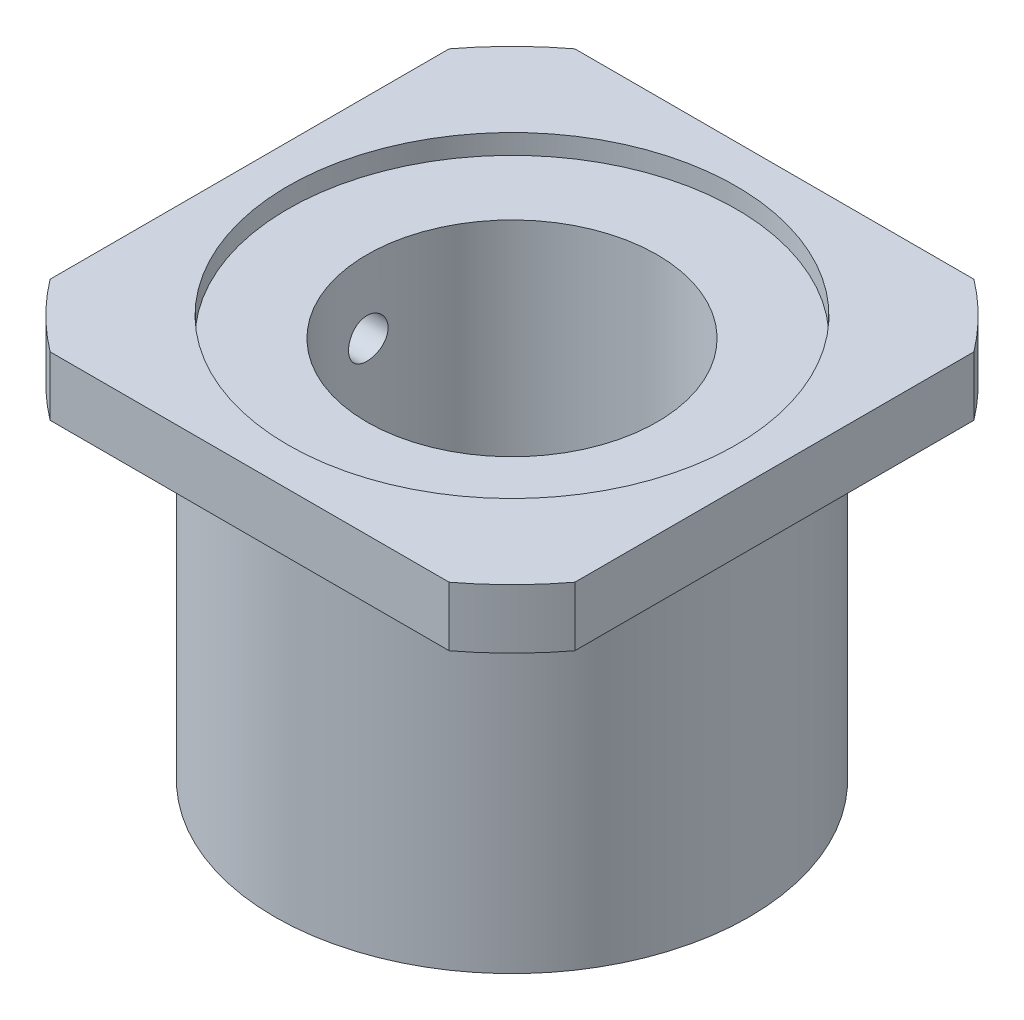
ISO-10303-21;
HEADER;
FILE_DESCRIPTION(('STEP AP214'),'2;1');
FILE_NAME('part.step','',(''),(''),'','','');
FILE_SCHEMA(('AUTOMOTIVE_DESIGN { 1 0 10303 214 1 1 1 1 }'));
ENDSEC;
DATA;
#1=APPLICATION_CONTEXT('core data for automotive mechanical design processes');
#2=APPLICATION_PROTOCOL_DEFINITION('international standard','automotive_design',2000,#1);
#3=PRODUCT_CONTEXT('',#1,'mechanical');
#4=PRODUCT('Part','Part','',(#3));
#5=PRODUCT_RELATED_PRODUCT_CATEGORY('part','',(#4));
#6=PRODUCT_DEFINITION_FORMATION('','',#4);
#7=PRODUCT_DEFINITION_CONTEXT('part definition',#1,'design');
#8=PRODUCT_DEFINITION('design','',#6,#7);
#9=PRODUCT_DEFINITION_SHAPE('','',#8);
#10=(LENGTH_UNIT() NAMED_UNIT(*) SI_UNIT(.MILLI.,.METRE.));
#11=(NAMED_UNIT(*) PLANE_ANGLE_UNIT() SI_UNIT($,.RADIAN.));
#12=(NAMED_UNIT(*) SI_UNIT($,.STERADIAN.) SOLID_ANGLE_UNIT());
#13=UNCERTAINTY_MEASURE_WITH_UNIT(LENGTH_MEASURE(1.E-05),#10,'distance_accuracy_value','');
#14=(GEOMETRIC_REPRESENTATION_CONTEXT(3) GLOBAL_UNCERTAINTY_ASSIGNED_CONTEXT((#13)) GLOBAL_UNIT_ASSIGNED_CONTEXT((#10,
#11,#12)) REPRESENTATION_CONTEXT('',''));
#15=CARTESIAN_POINT('',(0.,0.,0.));
#16=DIRECTION('',(0.,0.,1.));
#17=DIRECTION('',(1.,0.,0.));
#18=AXIS2_PLACEMENT_3D('',#15,#16,#17);
#19=CARTESIAN_POINT('',(0.,47.,0.));
#20=DIRECTION('',(0.,1.,0.));
#21=DIRECTION('',(0.,0.,1.));
#22=AXIS2_PLACEMENT_3D('',#19,#20,#21);
#23=PLANE('',#22);
#24=CARTESIAN_POINT('',(0.,47.,0.));
#25=DIRECTION('',(0.,1.,0.));
#26=DIRECTION('',(0.,0.,1.));
#27=AXIS2_PLACEMENT_3D('',#24,#25,#26);
#28=CIRCLE('',#27,11.);
#29=CARTESIAN_POINT('',(0.,47.,11.));
#30=VERTEX_POINT('',#29);
#31=EDGE_CURVE('E240',#30,#30,#28,.F.);
#32=ORIENTED_EDGE('',*,*,#31,.T.);
#33=EDGE_LOOP('',(#32));
#34=FACE_BOUND('',#33,.T.);
#35=CARTESIAN_POINT('',(0.,47.,0.));
#36=DIRECTION('',(0.,1.,0.));
#37=DIRECTION('',(0.,0.,1.));
#38=AXIS2_PLACEMENT_3D('',#35,#36,#37);
#39=CIRCLE('',#38,17.);
#40=CARTESIAN_POINT('',(0.,47.,17.));
#41=VERTEX_POINT('',#40);
#42=EDGE_CURVE('E13',#41,#41,#39,.F.);
#43=ORIENTED_EDGE('',*,*,#42,.F.);
#44=EDGE_LOOP('',(#43));
#45=FACE_BOUND('',#44,.T.);
#46=ADVANCED_FACE('F41',(#34,#45),#23,.T.);
#47=CARTESIAN_POINT('',(0.,120.710678118655,0.));
#48=DIRECTION('',(0.,-1.,0.));
#49=DIRECTION('',(0.,0.,-1.));
#50=AXIS2_PLACEMENT_3D('',#47,#48,#49);
#51=CYLINDRICAL_SURFACE('',#50,18.);
#52=CARTESIAN_POINT('',(0.,18.,0.));
#53=DIRECTION('',(0.,-1.,0.));
#54=DIRECTION('',(0.,0.,-1.));
#55=AXIS2_PLACEMENT_3D('',#52,#53,#54);
#56=CIRCLE('',#55,18.);
#57=CARTESIAN_POINT('',(0.,18.,-18.));
#58=VERTEX_POINT('',#57);
#59=EDGE_CURVE('E118',#58,#58,#56,.T.);
#60=ORIENTED_EDGE('',*,*,#59,.F.);
#61=EDGE_LOOP('',(#60));
#62=FACE_BOUND('',#61,.T.);
#63=CARTESIAN_POINT('',(0.,44.,0.));
#64=DIRECTION('',(0.,-1.,0.));
#65=DIRECTION('',(0.,0.,-1.));
#66=AXIS2_PLACEMENT_3D('',#63,#64,#65);
#67=CIRCLE('',#66,18.);
#68=CARTESIAN_POINT('',(0.,44.,-18.));
#69=VERTEX_POINT('',#68);
#70=EDGE_CURVE('E49',#69,#69,#67,.F.);
#71=ORIENTED_EDGE('',*,*,#70,.F.);
#72=EDGE_LOOP('',(#71));
#73=FACE_BOUND('',#72,.T.);
#74=CARTESIAN_POINT('',(-17.9373911146521,41.5,1.49999999999992));
#75=CARTESIAN_POINT('',(-17.9373919441254,41.4159014368144,1.49999632624549));
#76=CARTESIAN_POINT('',(-17.9379889197393,41.3317456207635,1.49290363793965));
#77=CARTESIAN_POINT('',(-17.940312296239,41.1657624694848,1.46471396861135));
#78=CARTESIAN_POINT('',(-17.942039976827,41.0839378823086,1.4436011195424));
#79=CARTESIAN_POINT('',(-17.9464277324401,40.925045205812,1.38798597710621));
#80=CARTESIAN_POINT('',(-17.949087278784,40.8479744485676,1.35349127456321));
#81=CARTESIAN_POINT('',(-17.9550384405243,40.7007352071851,1.27210510272811));
#82=CARTESIAN_POINT('',(-17.9583299207505,40.6305652518174,1.22521628371896));
#83=CARTESIAN_POINT('',(-17.9651835716923,40.4989209954,1.12024280468697));
#84=CARTESIAN_POINT('',(-17.9687463415354,40.4374668522055,1.06213290210273));
#85=CARTESIAN_POINT('',(-17.9757356491616,40.325171850643,0.936420181014058));
#86=CARTESIAN_POINT('',(-17.9791621809873,40.2743314559686,0.868816947980433));
#87=CARTESIAN_POINT('',(-17.9854986076128,40.1846400780157,0.725916367963101));
#88=CARTESIAN_POINT('',(-17.9884077482992,40.1458065352278,0.650608038188705));
#89=CARTESIAN_POINT('',(-17.9933751565843,40.0813427633222,0.494511600748062));
#90=CARTESIAN_POINT('',(-17.995433439076,40.0557123031027,0.41372358902416));
#91=CARTESIAN_POINT('',(-17.99846303179,40.0184402742159,0.249161693921634));
#92=CARTESIAN_POINT('',(-17.9994368756993,40.0067660933208,0.165395244348399));
#93=CARTESIAN_POINT('',(-18.0001964510134,39.9976371952231,-0.00291342283481244));
#94=CARTESIAN_POINT('',(-17.9999822045124,40.0001822135951,-0.0874556259894064));
#95=CARTESIAN_POINT('',(-17.9983918295819,40.0193927982691,-0.254694827278307));
#96=CARTESIAN_POINT('',(-17.9970185868379,40.0360232947063,-0.337395885108784));
#97=CARTESIAN_POINT('',(-17.9932679978193,40.0828782264431,-0.498828699060453));
#98=CARTESIAN_POINT('',(-17.9908906419909,40.1131027910838,-0.577560417407338));
#99=CARTESIAN_POINT('',(-17.9853943186844,40.1863269806778,-0.728931240955368));
#100=CARTESIAN_POINT('',(-17.9822744403804,40.2293423118981,-0.801562713988543));
#101=CARTESIAN_POINT('',(-17.9756436790388,40.3269155823679,-0.938588003816135));
#102=CARTESIAN_POINT('',(-17.9721327880706,40.3814737557484,-1.00298165347489));
#103=CARTESIAN_POINT('',(-17.965101971209,40.5007816599329,-1.12190844717293));
#104=CARTESIAN_POINT('',(-17.96158205029,40.5655618642282,-1.17641102499762));
#105=CARTESIAN_POINT('',(-17.9549406265857,40.7033687576745,-1.27377239838414));
#106=CARTESIAN_POINT('',(-17.9518191241289,40.7763954536233,-1.31663118434756));
#107=CARTESIAN_POINT('',(-17.9463273914548,40.9286438316577,-1.38948720688996));
#108=CARTESIAN_POINT('',(-17.9439572539101,41.0078662764203,-1.41948285710213));
#109=CARTESIAN_POINT('',(-17.9402383991997,41.1702470770765,-1.46573851054285));
#110=CARTESIAN_POINT('',(-17.9388896605602,41.2534053501847,-1.48199880254229));
#111=CARTESIAN_POINT('',(-17.937369793448,41.4210297798329,-1.50028347436901));
#112=CARTESIAN_POINT('',(-17.9371951390236,41.5054912561703,-1.50235047917691));
#113=CARTESIAN_POINT('',(-17.9380339082073,41.6735595154744,-1.49230155756731));
#114=CARTESIAN_POINT('',(-17.9390473207338,41.7571663064058,-1.48018576343831));
#115=CARTESIAN_POINT('',(-17.9421448221712,41.9210295336993,-1.4421507018638));
#116=CARTESIAN_POINT('',(-17.9442273679871,42.0012906189446,-1.41625132648426));
#117=CARTESIAN_POINT('',(-17.9492272046942,42.1563281232456,-1.35140451334484));
#118=CARTESIAN_POINT('',(-17.9521445089793,42.2311044542729,-1.31245686622068));
#119=CARTESIAN_POINT('',(-17.9584937019478,42.3732448783289,-1.2225112319685));
#120=CARTESIAN_POINT('',(-17.9619267965011,42.4405909425976,-1.17148484052764));
#121=CARTESIAN_POINT('',(-17.9689166666067,42.5657769113602,-1.05887119262334));
#122=CARTESIAN_POINT('',(-17.9724734442863,42.6236166522435,-0.997283754433981));
#123=CARTESIAN_POINT('',(-17.9793204166324,42.7282936086551,-0.865112059367695));
#124=CARTESIAN_POINT('',(-17.9826099269711,42.7751031295047,-0.794505828614824));
#125=CARTESIAN_POINT('',(-17.9885418580659,42.8562008703468,-0.646410289821683));
#126=CARTESIAN_POINT('',(-17.9911842852881,42.8904892154631,-0.56892105057274));
#127=CARTESIAN_POINT('',(-17.9955211682902,42.9455237236241,-0.409358368150632));
#128=CARTESIAN_POINT('',(-17.9972168225275,42.9662870127188,-0.327290865780985));
#129=CARTESIAN_POINT('',(-17.9994739699475,42.9937379886311,-0.160819768599526));
#130=CARTESIAN_POINT('',(-18.0000354845981,43.0004259418774,-0.0764162180368215));
#131=CARTESIAN_POINT('',(-17.9999611181007,42.9995332905985,0.0920580725937739));
#132=CARTESIAN_POINT('',(-17.9993288589703,42.9919958472422,0.176129046317001));
#133=CARTESIAN_POINT('',(-17.9969451509331,42.9629563682327,0.341806668091923));
#134=CARTESIAN_POINT('',(-17.9951937005063,42.9414543136124,0.423413312796343));
#135=CARTESIAN_POINT('',(-17.990768125559,42.8851069448164,0.58184856967305));
#136=CARTESIAN_POINT('',(-17.9880940546532,42.8502624059756,0.658677459180312));
#137=CARTESIAN_POINT('',(-17.9821223994119,42.7682241319035,0.805401859348455));
#138=CARTESIAN_POINT('',(-17.9788248249368,42.7210305919612,0.875297479629008));
#139=CARTESIAN_POINT('',(-17.9719643775245,42.6154719777264,1.00639213413811));
#140=CARTESIAN_POINT('',(-17.9684007644022,42.5570749669802,1.06756541397684));
#141=CARTESIAN_POINT('',(-17.9614161747032,42.430824746911,1.17926673983924));
#142=CARTESIAN_POINT('',(-17.9579952328797,42.3629692508757,1.22979220417227));
#143=CARTESIAN_POINT('',(-17.9516763661302,42.2195964989486,1.3188320684682));
#144=CARTESIAN_POINT('',(-17.9487794332231,42.1440651249981,1.35732378518762));
#145=CARTESIAN_POINT('',(-17.9438486940789,41.9876388448981,1.42102935140061));
#146=CARTESIAN_POINT('',(-17.9418138960345,41.9067502263742,1.44625846639412));
#147=CARTESIAN_POINT('',(-17.939361122821,41.7711536736592,1.47629714700905));
#148=CARTESIAN_POINT('',(-17.9386257658358,41.7173178208321,1.48517390108758));
#149=CARTESIAN_POINT('',(-17.9376404935845,41.6089959952377,1.49702651025991));
#150=CARTESIAN_POINT('',(-17.9373905770138,41.5545100242178,1.50000238121115));
#151=CARTESIAN_POINT('',(-17.9373911146521,41.5,1.49999999999992));
#152=B_SPLINE_CURVE_WITH_KNOTS('',3,(#74,#75,#76,#77,#78,#79,#80,#81,#82,#83,#84,#85,#86,#87,
#88,#89,#90,#91,#92,#93,#94,#95,#96,#97,#98,#99,#100,#101,#102,#103,#104,#105,#106,#107,#108,
#109,#110,#111,#112,#113,#114,#115,#116,#117,#118,#119,#120,#121,#122,#123,#124,#125,#126,#127,
#128,#129,#130,#131,#132,#133,#134,#135,#136,#137,#138,#139,#140,#141,#142,#143,#144,#145,#146,
#147,#148,#149,#150,#151),.UNSPECIFIED.,.T.,.F.,(4,2,2,2,2,2,2,2,2,2,2,2,2,2,2,2,2,2,2,2,2,2,2,
2,2,2,2,2,2,2,2,2,2,2,2,2,2,2,4),(0.,0.25209666307589,0.504479137075762,0.756718656565784,
1.00890428225374,1.26166396783763,1.51443469368452,1.76757087390709,2.02070262317667,
2.27324170533034,2.52577609119157,2.77768356187026,3.02959342937964,3.28181391301508,
3.53403951309371,3.78703176034209,4.0400242161406,4.29304786367221,4.54606619152565,
4.79832432644862,5.05058010848024,5.3024728255471,5.55436958451819,5.80686469264508,
6.05936414593926,6.31249097605478,6.56561527661195,6.81841843321506,7.07121680452792,
7.32324939506093,7.575282327912,7.82730061729244,8.07931492145808,8.33205858485542,
8.58486345866072,8.83814202808076,9.09112842731077,9.25452993641401,9.41793100640812),.UNSPECIFIED.);
#153=CARTESIAN_POINT('',(-17.9373911146521,41.5,1.49999999999992));
#154=VERTEX_POINT('',#153);
#155=EDGE_CURVE('E152',#154,#154,#152,.T.);
#156=ORIENTED_EDGE('',*,*,#155,.T.);
#157=EDGE_LOOP('',(#156));
#158=FACE_BOUND('',#157,.T.);
#159=ADVANCED_FACE('F182',(#62,#73,#158),#51,.T.);
#160=CARTESIAN_POINT('',(0.,50.,0.));
#161=DIRECTION('',(0.,-1.,0.));
#162=DIRECTION('',(0.,0.,-1.));
#163=AXIS2_PLACEMENT_3D('',#160,#161,#162);
#164=CYLINDRICAL_SURFACE('',#163,25.);
#165=DIRECTION('',(0.,1.,0.));
#166=VECTOR('',#165,1.);
#167=CARTESIAN_POINT('',(-19.8999999999999,15.3084702238548,-15.1324155375142));
#168=LINE('',#167,#166);
#169=CARTESIAN_POINT('',(-19.8999999999999,44.,-15.1324155375142));
#170=VERTEX_POINT('',#169);
#171=CARTESIAN_POINT('',(-19.8999999999999,48.5,-15.1324155375142));
#172=VERTEX_POINT('',#171);
#173=EDGE_CURVE('E108',#170,#172,#168,.T.);
#174=ORIENTED_EDGE('',*,*,#173,.T.);
#175=CARTESIAN_POINT('',(0.,48.5,0.));
#176=DIRECTION('',(0.,1.,0.));
#177=DIRECTION('',(0.,0.,1.));
#178=AXIS2_PLACEMENT_3D('',#175,#176,#177);
#179=CIRCLE('',#178,25.);
#180=CARTESIAN_POINT('',(-15.1324155375141,48.5,-19.9000000000001));
#181=VERTEX_POINT('',#180);
#182=EDGE_CURVE('E111',#181,#172,#179,.T.);
#183=ORIENTED_EDGE('',*,*,#182,.F.);
#184=DIRECTION('',(0.,1.,0.));
#185=VECTOR('',#184,1.);
#186=CARTESIAN_POINT('',(-15.1324155375141,15.3084702238548,-19.9000000000001));
#187=LINE('',#186,#185);
#188=CARTESIAN_POINT('',(-15.1324155375141,44.,-19.9000000000001));
#189=VERTEX_POINT('',#188);
#190=EDGE_CURVE('E256',#189,#181,#187,.T.);
#191=ORIENTED_EDGE('',*,*,#190,.F.);
#192=CARTESIAN_POINT('',(0.,44.,0.));
#193=DIRECTION('',(0.,-1.,0.));
#194=DIRECTION('',(0.,0.,-1.));
#195=AXIS2_PLACEMENT_3D('',#192,#193,#194);
#196=CIRCLE('',#195,25.);
#197=EDGE_CURVE('E113',#170,#189,#196,.T.);
#198=ORIENTED_EDGE('',*,*,#197,.F.);
#199=EDGE_LOOP('',(#174,#183,#191,#198));
#200=FACE_BOUND('',#199,.T.);
#201=ADVANCED_FACE('F43',(#200),#164,.T.);
#202=DIRECTION('',(0.,1.,0.));
#203=VECTOR('',#202,1.);
#204=CARTESIAN_POINT('',(-15.1324155375143,15.3084702238548,19.8999999999999));
#205=LINE('',#204,#203);
#206=CARTESIAN_POINT('',(-15.1324155375143,44.,19.8999999999999));
#207=VERTEX_POINT('',#206);
#208=CARTESIAN_POINT('',(-15.1324155375143,48.5,19.8999999999999));
#209=VERTEX_POINT('',#208);
#210=EDGE_CURVE('E56',#207,#209,#205,.T.);
#211=ORIENTED_EDGE('',*,*,#210,.T.);
#212=CARTESIAN_POINT('',(0.,48.5,0.));
#213=DIRECTION('',(0.,1.,0.));
#214=DIRECTION('',(0.,0.,1.));
#215=AXIS2_PLACEMENT_3D('',#212,#213,#214);
#216=CIRCLE('',#215,25.);
#217=CARTESIAN_POINT('',(-19.9000000000002,48.5,15.132415537514));
#218=VERTEX_POINT('',#217);
#219=EDGE_CURVE('E126',#218,#209,#216,.T.);
#220=ORIENTED_EDGE('',*,*,#219,.F.);
#221=DIRECTION('',(0.,1.,0.));
#222=VECTOR('',#221,1.);
#223=CARTESIAN_POINT('',(-19.9000000000001,15.3084702238548,15.132415537514));
#224=LINE('',#223,#222);
#225=CARTESIAN_POINT('',(-19.9000000000001,44.,15.132415537514));
#226=VERTEX_POINT('',#225);
#227=EDGE_CURVE('E117',#226,#218,#224,.T.);
#228=ORIENTED_EDGE('',*,*,#227,.F.);
#229=CARTESIAN_POINT('',(0.,44.,0.));
#230=DIRECTION('',(0.,-1.,0.));
#231=DIRECTION('',(0.,0.,-1.));
#232=AXIS2_PLACEMENT_3D('',#229,#230,#231);
#233=CIRCLE('',#232,25.);
#234=EDGE_CURVE('E292',#207,#226,#233,.T.);
#235=ORIENTED_EDGE('',*,*,#234,.F.);
#236=EDGE_LOOP('',(#211,#220,#228,#235));
#237=FACE_BOUND('',#236,.T.);
#238=ADVANCED_FACE('F318',(#237),#164,.T.);
#239=DIRECTION('',(0.,1.,0.));
#240=VECTOR('',#239,1.);
#241=CARTESIAN_POINT('',(15.1324155375142,15.3084702238548,-19.8999999999999));
#242=LINE('',#241,#240);
#243=CARTESIAN_POINT('',(15.1324155375142,44.,-19.8999999999999));
#244=VERTEX_POINT('',#243);
#245=CARTESIAN_POINT('',(15.1324155375142,48.5,-19.8999999999999));
#246=VERTEX_POINT('',#245);
#247=EDGE_CURVE('E258',#244,#246,#242,.T.);
#248=ORIENTED_EDGE('',*,*,#247,.T.);
#249=CARTESIAN_POINT('',(0.,48.5,0.));
#250=DIRECTION('',(0.,1.,0.));
#251=DIRECTION('',(0.,0.,1.));
#252=AXIS2_PLACEMENT_3D('',#249,#250,#251);
#253=CIRCLE('',#252,25.);
#254=CARTESIAN_POINT('',(19.9,48.5,-15.1324155375141));
#255=VERTEX_POINT('',#254);
#256=EDGE_CURVE('E149',#255,#246,#253,.T.);
#257=ORIENTED_EDGE('',*,*,#256,.F.);
#258=DIRECTION('',(0.,1.,0.));
#259=VECTOR('',#258,1.);
#260=CARTESIAN_POINT('',(19.9,15.3084702238548,-15.1324155375141));
#261=LINE('',#260,#259);
#262=CARTESIAN_POINT('',(19.9,44.,-15.1324155375141));
#263=VERTEX_POINT('',#262);
#264=EDGE_CURVE('E260',#263,#255,#261,.T.);
#265=ORIENTED_EDGE('',*,*,#264,.F.);
#266=CARTESIAN_POINT('',(0.,44.,0.));
#267=DIRECTION('',(0.,-1.,0.));
#268=DIRECTION('',(0.,0.,-1.));
#269=AXIS2_PLACEMENT_3D('',#266,#267,#268);
#270=CIRCLE('',#269,25.);
#271=EDGE_CURVE('E283',#244,#263,#270,.T.);
#272=ORIENTED_EDGE('',*,*,#271,.F.);
#273=EDGE_LOOP('',(#248,#257,#265,#272));
#274=FACE_BOUND('',#273,.T.);
#275=ADVANCED_FACE('F324',(#274),#164,.T.);
#276=DIRECTION('',(0.,1.,0.));
#277=VECTOR('',#276,1.);
#278=CARTESIAN_POINT('',(19.8999999999999,15.3084702238548,15.1324155375143));
#279=LINE('',#278,#277);
#280=CARTESIAN_POINT('',(19.8999999999999,44.,15.1324155375143));
#281=VERTEX_POINT('',#280);
#282=CARTESIAN_POINT('',(19.8999999999999,48.5,15.1324155375143));
#283=VERTEX_POINT('',#282);
#284=EDGE_CURVE('E253',#281,#283,#279,.T.);
#285=ORIENTED_EDGE('',*,*,#284,.T.);
#286=CARTESIAN_POINT('',(0.,48.5,0.));
#287=DIRECTION('',(0.,1.,0.));
#288=DIRECTION('',(0.,0.,1.));
#289=AXIS2_PLACEMENT_3D('',#286,#287,#288);
#290=CIRCLE('',#289,25.);
#291=CARTESIAN_POINT('',(15.1324155375141,48.5,19.9000000000001));
#292=VERTEX_POINT('',#291);
#293=EDGE_CURVE('E143',#292,#283,#290,.T.);
#294=ORIENTED_EDGE('',*,*,#293,.F.);
#295=DIRECTION('',(0.,1.,0.));
#296=VECTOR('',#295,1.);
#297=CARTESIAN_POINT('',(15.1324155375141,15.3084702238548,19.9000000000001));
#298=LINE('',#297,#296);
#299=CARTESIAN_POINT('',(15.1324155375141,44.,19.9000000000001));
#300=VERTEX_POINT('',#299);
#301=EDGE_CURVE('E64',#300,#292,#298,.T.);
#302=ORIENTED_EDGE('',*,*,#301,.F.);
#303=CARTESIAN_POINT('',(0.,44.,0.));
#304=DIRECTION('',(0.,-1.,0.));
#305=DIRECTION('',(0.,0.,-1.));
#306=AXIS2_PLACEMENT_3D('',#303,#304,#305);
#307=CIRCLE('',#306,25.);
#308=EDGE_CURVE('E278',#281,#300,#307,.T.);
#309=ORIENTED_EDGE('',*,*,#308,.F.);
#310=EDGE_LOOP('',(#285,#294,#302,#309));
#311=FACE_BOUND('',#310,.T.);
#312=ADVANCED_FACE('F191',(#311),#164,.T.);
#313=CARTESIAN_POINT('',(0.,15.3084702238548,19.9));
#314=DIRECTION('',(0.,0.,-1.));
#315=DIRECTION('',(-1.,0.,0.));
#316=AXIS2_PLACEMENT_3D('',#313,#314,#315);
#317=PLANE('',#316);
#318=ORIENTED_EDGE('',*,*,#301,.T.);
#319=DIRECTION('',(1.,0.,0.));
#320=VECTOR('',#319,1.);
#321=CARTESIAN_POINT('',(-15.1324155375143,48.5,19.8999999999999));
#322=LINE('',#321,#320);
#323=EDGE_CURVE('E140',#209,#292,#322,.T.);
#324=ORIENTED_EDGE('',*,*,#323,.F.);
#325=ORIENTED_EDGE('',*,*,#210,.F.);
#326=DIRECTION('',(-1.,0.,0.));
#327=VECTOR('',#326,1.);
#328=CARTESIAN_POINT('',(0.,44.,19.9));
#329=LINE('',#328,#327);
#330=EDGE_CURVE('E276',#300,#207,#329,.T.);
#331=ORIENTED_EDGE('',*,*,#330,.F.);
#332=EDGE_LOOP('',(#318,#324,#325,#331));
#333=FACE_BOUND('',#332,.T.);
#334=ADVANCED_FACE('F187',(#333),#317,.F.);
#335=CARTESIAN_POINT('',(19.9,15.3084702238548,0.));
#336=DIRECTION('',(-1.,0.,0.));
#337=DIRECTION('',(0.,0.,1.));
#338=AXIS2_PLACEMENT_3D('',#335,#336,#337);
#339=PLANE('',#338);
#340=ORIENTED_EDGE('',*,*,#264,.T.);
#341=DIRECTION('',(0.,0.,-1.));
#342=VECTOR('',#341,1.);
#343=CARTESIAN_POINT('',(19.8999999999999,48.5,15.1324155375143));
#344=LINE('',#343,#342);
#345=EDGE_CURVE('E146',#283,#255,#344,.T.);
#346=ORIENTED_EDGE('',*,*,#345,.F.);
#347=ORIENTED_EDGE('',*,*,#284,.F.);
#348=DIRECTION('',(0.,0.,1.));
#349=VECTOR('',#348,1.);
#350=CARTESIAN_POINT('',(19.9,44.,0.));
#351=LINE('',#350,#349);
#352=EDGE_CURVE('E280',#263,#281,#351,.T.);
#353=ORIENTED_EDGE('',*,*,#352,.F.);
#354=EDGE_LOOP('',(#340,#346,#347,#353));
#355=FACE_BOUND('',#354,.T.);
#356=ADVANCED_FACE('F190',(#355),#339,.F.);
#357=CARTESIAN_POINT('',(0.,15.3084702238548,-19.9));
#358=DIRECTION('',(0.,0.,1.));
#359=DIRECTION('',(1.,0.,0.));
#360=AXIS2_PLACEMENT_3D('',#357,#358,#359);
#361=PLANE('',#360);
#362=ORIENTED_EDGE('',*,*,#190,.T.);
#363=DIRECTION('',(-1.,0.,0.));
#364=VECTOR('',#363,1.);
#365=CARTESIAN_POINT('',(15.1324155375142,48.5,-19.8999999999999));
#366=LINE('',#365,#364);
#367=EDGE_CURVE('E133',#246,#181,#366,.T.);
#368=ORIENTED_EDGE('',*,*,#367,.F.);
#369=ORIENTED_EDGE('',*,*,#247,.F.);
#370=DIRECTION('',(1.,0.,0.));
#371=VECTOR('',#370,1.);
#372=CARTESIAN_POINT('',(0.,44.,-19.9));
#373=LINE('',#372,#371);
#374=EDGE_CURVE('E286',#189,#244,#373,.T.);
#375=ORIENTED_EDGE('',*,*,#374,.F.);
#376=EDGE_LOOP('',(#362,#368,#369,#375));
#377=FACE_BOUND('',#376,.T.);
#378=ADVANCED_FACE('F195',(#377),#361,.F.);
#379=CARTESIAN_POINT('',(-19.9,15.3084702238548,-1.27836430677052E-13));
#380=DIRECTION('',(-1.,0.,0.));
#381=DIRECTION('',(0.,0.,1.));
#382=AXIS2_PLACEMENT_3D('',#379,#380,#381);
#383=PLANE('',#382);
#384=ORIENTED_EDGE('',*,*,#227,.T.);
#385=DIRECTION('',(0.,0.,1.));
#386=VECTOR('',#385,1.);
#387=CARTESIAN_POINT('',(-19.8999999999999,48.5,-15.1324155375142));
#388=LINE('',#387,#386);
#389=EDGE_CURVE('E121',#172,#218,#388,.T.);
#390=ORIENTED_EDGE('',*,*,#389,.F.);
#391=ORIENTED_EDGE('',*,*,#173,.F.);
#392=DIRECTION('',(0.,0.,-1.));
#393=VECTOR('',#392,1.);
#394=CARTESIAN_POINT('',(-19.9,44.,-1.27836430677052E-13));
#395=LINE('',#394,#393);
#396=EDGE_CURVE('E290',#226,#170,#395,.T.);
#397=ORIENTED_EDGE('',*,*,#396,.F.);
#398=EDGE_LOOP('',(#384,#390,#391,#397));
#399=FACE_BOUND('',#398,.T.);
#400=ADVANCED_FACE('F122',(#399),#383,.T.);
#401=CARTESIAN_POINT('',(-15.1324155375143,15.3084702238548,15.1324155375141));
#402=DIRECTION('',(0.,1.,0.));
#403=DIRECTION('',(0.,0.,1.));
#404=AXIS2_PLACEMENT_3D('',#401,#402,#403);
#405=CYLINDRICAL_SURFACE('',#404,1.5);
#406=CARTESIAN_POINT('',(-15.1324155375143,47.,15.1324155375141));
#407=DIRECTION('',(0.,1.,0.));
#408=DIRECTION('',(0.,0.,1.));
#409=AXIS2_PLACEMENT_3D('',#406,#407,#408);
#410=CIRCLE('',#409,1.5);
#411=CARTESIAN_POINT('',(-15.1324155375143,47.,16.6324155375141));
#412=VERTEX_POINT('',#411);
#413=EDGE_CURVE('E266',#412,#412,#410,.F.);
#414=ORIENTED_EDGE('',*,*,#413,.F.);
#415=EDGE_LOOP('',(#414));
#416=FACE_BOUND('',#415,.T.);
#417=CARTESIAN_POINT('',(-15.1324155375143,44.,15.1324155375141));
#418=DIRECTION('',(0.,-1.,0.));
#419=DIRECTION('',(0.,0.,-1.));
#420=AXIS2_PLACEMENT_3D('',#417,#418,#419);
#421=CIRCLE('',#420,1.5);
#422=CARTESIAN_POINT('',(-15.1324155375143,44.,13.6324155375141));
#423=VERTEX_POINT('',#422);
#424=EDGE_CURVE('E294',#423,#423,#421,.F.);
#425=ORIENTED_EDGE('',*,*,#424,.F.);
#426=EDGE_LOOP('',(#425));
#427=FACE_BOUND('',#426,.T.);
#428=ADVANCED_FACE('F194',(#416,#427),#405,.F.);
#429=CARTESIAN_POINT('',(15.1324155375141,15.3084702238548,15.1324155375142));
#430=DIRECTION('',(0.,1.,0.));
#431=DIRECTION('',(0.,0.,1.));
#432=AXIS2_PLACEMENT_3D('',#429,#430,#431);
#433=CYLINDRICAL_SURFACE('',#432,1.5);
#434=CARTESIAN_POINT('',(15.1324155375141,47.,15.1324155375142));
#435=DIRECTION('',(0.,1.,0.));
#436=DIRECTION('',(0.,0.,1.));
#437=AXIS2_PLACEMENT_3D('',#434,#435,#436);
#438=CIRCLE('',#437,1.5);
#439=CARTESIAN_POINT('',(15.1324155375141,47.,16.6324155375142));
#440=VERTEX_POINT('',#439);
#441=EDGE_CURVE('E269',#440,#440,#438,.F.);
#442=ORIENTED_EDGE('',*,*,#441,.F.);
#443=EDGE_LOOP('',(#442));
#444=FACE_BOUND('',#443,.T.);
#445=CARTESIAN_POINT('',(15.1324155375141,44.,15.1324155375142));
#446=DIRECTION('',(0.,-1.,0.));
#447=DIRECTION('',(0.,0.,-1.));
#448=AXIS2_PLACEMENT_3D('',#445,#446,#447);
#449=CIRCLE('',#448,1.5);
#450=CARTESIAN_POINT('',(15.1324155375141,44.,13.6324155375142));
#451=VERTEX_POINT('',#450);
#452=EDGE_CURVE('E249',#451,#451,#449,.F.);
#453=ORIENTED_EDGE('',*,*,#452,.F.);
#454=EDGE_LOOP('',(#453));
#455=FACE_BOUND('',#454,.T.);
#456=ADVANCED_FACE('F210',(#444,#455),#433,.F.);
#457=CARTESIAN_POINT('',(-15.1324155375143,15.3084702238548,-15.1324155375141));
#458=DIRECTION('',(0.,1.,0.));
#459=DIRECTION('',(0.,0.,1.));
#460=AXIS2_PLACEMENT_3D('',#457,#458,#459);
#461=CYLINDRICAL_SURFACE('',#460,1.5);
#462=CARTESIAN_POINT('',(-15.1324155375143,47.,-15.1324155375141));
#463=DIRECTION('',(0.,1.,0.));
#464=DIRECTION('',(0.,0.,1.));
#465=AXIS2_PLACEMENT_3D('',#462,#463,#464);
#466=CIRCLE('',#465,1.5);
#467=CARTESIAN_POINT('',(-15.1324155375143,47.,-13.6324155375141));
#468=VERTEX_POINT('',#467);
#469=EDGE_CURVE('E246',#468,#468,#466,.F.);
#470=ORIENTED_EDGE('',*,*,#469,.F.);
#471=EDGE_LOOP('',(#470));
#472=FACE_BOUND('',#471,.T.);
#473=CARTESIAN_POINT('',(-15.1324155375143,44.,-15.1324155375141));
#474=DIRECTION('',(0.,-1.,0.));
#475=DIRECTION('',(0.,0.,-1.));
#476=AXIS2_PLACEMENT_3D('',#473,#474,#475);
#477=CIRCLE('',#476,1.5);
#478=CARTESIAN_POINT('',(-15.1324155375143,44.,-16.6324155375141));
#479=VERTEX_POINT('',#478);
#480=EDGE_CURVE('E160',#479,#479,#477,.F.);
#481=ORIENTED_EDGE('',*,*,#480,.F.);
#482=EDGE_LOOP('',(#481));
#483=FACE_BOUND('',#482,.T.);
#484=ADVANCED_FACE('F206',(#472,#483),#461,.F.);
#485=CARTESIAN_POINT('',(15.1324155375142,15.3084702238548,-15.1324155375141));
#486=DIRECTION('',(0.,1.,0.));
#487=DIRECTION('',(0.,0.,1.));
#488=AXIS2_PLACEMENT_3D('',#485,#486,#487);
#489=CYLINDRICAL_SURFACE('',#488,1.5);
#490=CARTESIAN_POINT('',(15.1324155375142,47.,-15.1324155375141));
#491=DIRECTION('',(0.,1.,0.));
#492=DIRECTION('',(0.,0.,1.));
#493=AXIS2_PLACEMENT_3D('',#490,#491,#492);
#494=CIRCLE('',#493,1.5);
#495=CARTESIAN_POINT('',(15.1324155375142,47.,-13.6324155375141));
#496=VERTEX_POINT('',#495);
#497=EDGE_CURVE('E243',#496,#496,#494,.F.);
#498=ORIENTED_EDGE('',*,*,#497,.F.);
#499=EDGE_LOOP('',(#498));
#500=FACE_BOUND('',#499,.T.);
#501=CARTESIAN_POINT('',(15.1324155375142,44.,-15.1324155375141));
#502=DIRECTION('',(0.,-1.,0.));
#503=DIRECTION('',(0.,0.,-1.));
#504=AXIS2_PLACEMENT_3D('',#501,#502,#503);
#505=CIRCLE('',#504,1.5);
#506=CARTESIAN_POINT('',(15.1324155375142,44.,-16.6324155375141));
#507=VERTEX_POINT('',#506);
#508=EDGE_CURVE('E244',#507,#507,#505,.F.);
#509=ORIENTED_EDGE('',*,*,#508,.F.);
#510=EDGE_LOOP('',(#509));
#511=FACE_BOUND('',#510,.T.);
#512=ADVANCED_FACE('F202',(#500,#511),#489,.F.);
#513=CARTESIAN_POINT('',(0.,27.,0.));
#514=DIRECTION('',(0.,-1.,0.));
#515=DIRECTION('',(0.,0.,-1.));
#516=AXIS2_PLACEMENT_3D('',#513,#514,#515);
#517=CYLINDRICAL_SURFACE('',#516,11.);
#518=CARTESIAN_POINT('',(0.,18.,0.));
#519=DIRECTION('',(0.,-1.,0.));
#520=DIRECTION('',(0.,0.,-1.));
#521=AXIS2_PLACEMENT_3D('',#518,#519,#520);
#522=CIRCLE('',#521,11.);
#523=CARTESIAN_POINT('',(0.,18.,-11.));
#524=VERTEX_POINT('',#523);
#525=EDGE_CURVE('E237',#524,#524,#522,.T.);
#526=ORIENTED_EDGE('',*,*,#525,.T.);
#527=EDGE_LOOP('',(#526));
#528=FACE_BOUND('',#527,.T.);
#529=ORIENTED_EDGE('',*,*,#31,.F.);
#530=EDGE_LOOP('',(#529));
#531=FACE_BOUND('',#530,.T.);
#532=CARTESIAN_POINT('',(-10.8972473588517,41.5,1.49999999999995));
#533=CARTESIAN_POINT('',(-10.8972486564246,41.4161656721093,1.49999647698952));
#534=CARTESIAN_POINT('',(-10.8982252418973,41.3322805572325,1.49294806758784));
#535=CARTESIAN_POINT('',(-10.9020240848212,41.1668495253154,1.46494465313412));
#536=CARTESIAN_POINT('',(-10.9048482153533,41.0853060699751,1.44397553464771));
#537=CARTESIAN_POINT('',(-10.9120164610862,40.9269772144858,1.38876442813262));
#538=CARTESIAN_POINT('',(-10.9163594862124,40.850188448405,1.35453195700274));
#539=CARTESIAN_POINT('',(-10.9260748678033,40.7034580312526,1.27378718150823));
#540=CARTESIAN_POINT('',(-10.9314470631388,40.6335153109347,1.22727679897174));
#541=CARTESIAN_POINT('',(-10.9426553719722,40.5019854050149,1.12296630775033));
#542=CARTESIAN_POINT('',(-10.9484940481324,40.4404502396641,1.06510087202411));
#543=CARTESIAN_POINT('',(-10.9599544812632,40.3279321943143,0.939863725934441));
#544=CARTESIAN_POINT('',(-10.9655762269494,40.2769498626575,0.872491521889713));
#545=CARTESIAN_POINT('',(-10.9759958911666,40.1867955951033,0.729823366821369));
#546=CARTESIAN_POINT('',(-10.9807904666082,40.1476711234281,0.654497157455684));
#547=CARTESIAN_POINT('',(-10.9889873043899,40.0826474318913,0.498266779811052));
#548=CARTESIAN_POINT('',(-10.9923896278325,40.0567476316193,0.417362856506252));
#549=CARTESIAN_POINT('',(-10.9974005480408,40.019064968034,0.252807513813656));
#550=CARTESIAN_POINT('',(-10.9990201695525,40.0071953041486,0.169176312601163));
#551=CARTESIAN_POINT('',(-11.0003209080162,39.9976406190359,0.00109450994927767));
#552=CARTESIAN_POINT('',(-11.0000021148727,39.9999549399503,-0.0833560533064201));
#553=CARTESIAN_POINT('',(-10.9974708146634,40.0186334275864,-0.250088067047796));
#554=CARTESIAN_POINT('',(-10.9952708921096,40.0349042295158,-0.332380194950669));
#555=CARTESIAN_POINT('',(-10.9892385808312,40.0808876010157,-0.49305498432984));
#556=CARTESIAN_POINT('',(-10.9854061561925,40.1106004663042,-0.571437559756001));
#557=CARTESIAN_POINT('',(-10.9765177622816,40.1827222024898,-0.722354501083467));
#558=CARTESIAN_POINT('',(-10.9714579548357,40.2251710007936,-0.794869550825056));
#559=CARTESIAN_POINT('',(-10.9606799547905,40.321530549453,-0.93178232970173));
#560=CARTESIAN_POINT('',(-10.9549617263022,40.3754419247426,-0.996179615955395));
#561=CARTESIAN_POINT('',(-10.9434509857672,40.4937180059203,-1.1155781956143));
#562=CARTESIAN_POINT('',(-10.9376582477788,40.558164147509,-1.17049882841791));
#563=CARTESIAN_POINT('',(-10.9266970216767,40.6954019593368,-1.26875693038299));
#564=CARTESIAN_POINT('',(-10.9215285362526,40.7681936655287,-1.31209434964119));
#565=CARTESIAN_POINT('',(-10.9124011549528,40.920133450801,-1.38596314565068));
#566=CARTESIAN_POINT('',(-10.9084429442204,40.9992850983843,-1.41648727235614));
#567=CARTESIAN_POINT('',(-10.9021970767287,41.1616570305724,-1.46378734808382));
#568=CARTESIAN_POINT('',(-10.8999093235195,41.2448770799775,-1.48056409086717));
#569=CARTESIAN_POINT('',(-10.8972813444562,41.4123088435069,-1.49978470836064));
#570=CARTESIAN_POINT('',(-10.8969256464884,41.4965072516195,-1.50234245427453));
#571=CARTESIAN_POINT('',(-10.8981610658355,41.6641314179332,-1.49335366146555));
#572=CARTESIAN_POINT('',(-10.8997521335324,41.747557195772,-1.48180748221552));
#573=CARTESIAN_POINT('',(-10.9046876535817,41.9109217325789,-1.44503477726892));
#574=CARTESIAN_POINT('',(-10.9080249489812,41.9908732927462,-1.41986407756193));
#575=CARTESIAN_POINT('',(-10.9160710546304,42.1454217246297,-1.35661456156872));
#576=CARTESIAN_POINT('',(-10.920779921637,42.2200183745958,-1.31853521110036));
#577=CARTESIAN_POINT('',(-10.9310754038899,42.3622526062227,-1.23027212104662));
#578=CARTESIAN_POINT('',(-10.9366673277263,42.4298437161264,-1.18001412272536));
#579=CARTESIAN_POINT('',(-10.9480824916708,42.5556725024343,-1.06892459273354));
#580=CARTESIAN_POINT('',(-10.9539057425193,42.6139097439009,-1.00809256966391));
#581=CARTESIAN_POINT('',(-10.9651753220022,42.7197815268094,-0.877082587451403));
#582=CARTESIAN_POINT('',(-10.9706188057852,42.7673409644625,-0.806843655242718));
#583=CARTESIAN_POINT('',(-10.9804722800966,42.8499858890388,-0.659307817820912));
#584=CARTESIAN_POINT('',(-10.9848822947688,42.885071667381,-0.582011077550646));
#585=CARTESIAN_POINT('',(-10.9921593898811,42.9416510259285,-0.422796808531987));
#586=CARTESIAN_POINT('',(-10.9950312777662,42.9631869936464,-0.340894571774343));
#587=CARTESIAN_POINT('',(-10.9989285965487,42.9921930076761,-0.174594562810547));
#588=CARTESIAN_POINT('',(-10.9999541273742,42.9996638152196,-0.0901969259110602));
#589=CARTESIAN_POINT('',(-11.0000424834892,43.0003113327712,0.0779669723968437));
#590=CARTESIAN_POINT('',(-10.9991211561704,42.9936034568827,0.161732804273455));
#591=CARTESIAN_POINT('',(-10.9954510037266,42.9663297343614,0.326934263752167));
#592=CARTESIAN_POINT('',(-10.9927021816854,42.945763911113,0.40836989528609));
#593=CARTESIAN_POINT('',(-10.9856844439666,42.8913964072043,0.566576938829267));
#594=CARTESIAN_POINT('',(-10.9814162872104,42.8576013338351,0.643350657134365));
#595=CARTESIAN_POINT('',(-10.9718308359542,42.7777466977595,0.790155796425655));
#596=CARTESIAN_POINT('',(-10.9665135194962,42.7316868783562,0.860187076253116));
#597=CARTESIAN_POINT('',(-10.9553706532258,42.6281872132776,0.99210736430218));
#598=CARTESIAN_POINT('',(-10.9495414757205,42.5706617320395,1.05392888468766));
#599=CARTESIAN_POINT('',(-10.9380600025812,42.4460431220091,1.16708474239227));
#600=CARTESIAN_POINT('',(-10.932407748966,42.3789477411135,1.21841660422228));
#601=CARTESIAN_POINT('',(-10.9218923119176,42.2367351533139,1.30934306690388));
#602=CARTESIAN_POINT('',(-10.9170328791241,42.1615824541713,1.34888257108227));
#603=CARTESIAN_POINT('',(-10.9086971841689,42.0056762076501,1.41472146000487));
#604=CARTESIAN_POINT('',(-10.905219448162,41.9249287367712,1.44103496081356));
#605=CARTESIAN_POINT('',(-10.9008677643292,41.7864886017611,1.47351601612995));
#606=CARTESIAN_POINT('',(-10.8995170601619,41.7296617888032,1.48343283892755));
#607=CARTESIAN_POINT('',(-10.8977064157815,41.6152313114377,1.49667600965622));
#608=CARTESIAN_POINT('',(-10.897246466901,41.5576276545947,1.5000024217147));
#609=CARTESIAN_POINT('',(-10.8972473588517,41.5,1.49999999999995));
#610=B_SPLINE_CURVE_WITH_KNOTS('',3,(#532,#533,#534,#535,#536,#537,#538,#539,#540,#541,#542,
#543,#544,#545,#546,#547,#548,#549,#550,#551,#552,#553,#554,#555,#556,#557,#558,#559,#560,#561,
#562,#563,#564,#565,#566,#567,#568,#569,#570,#571,#572,#573,#574,#575,#576,#577,#578,#579,#580,
#581,#582,#583,#584,#585,#586,#587,#588,#589,#590,#591,#592,#593,#594,#595,#596,#597,#598,#599,
#600,#601,#602,#603,#604,#605,#606,#607,#608,#609),.UNSPECIFIED.,.T.,.F.,(4,2,2,2,2,2,2,2,2,2,2,
2,2,2,2,2,2,2,2,2,2,2,2,2,2,2,2,2,2,2,2,2,2,2,2,2,2,2,4),(0.,0.251292413652355,
0.502839988614748,0.754207403054467,1.0055354949411,1.25835430174809,1.51118624213233,
1.76501723524539,2.01883708715133,2.27107826705026,2.52330774799944,2.77386293073417,
3.02442362581396,3.27577819064359,3.52714646271321,3.7805587131172,4.03397205526462,
4.28752859167036,4.54107048692651,4.79257896376821,5.04408103043816,5.29456029222847,
5.54504992054631,5.79710712919647,6.04917605465384,6.30296596167167,6.55674993906904,
6.80973601099936,7.06270839047521,7.31362951480924,7.56455021573113,7.81534575497389,
8.06614654369507,8.31889590223294,8.57170483921674,8.82567709259418,9.07937770366514,
9.25211760261271,9.42485582072185),.UNSPECIFIED.);
#611=CARTESIAN_POINT('',(-10.8972473588517,41.5,1.49999999999995));
#612=VERTEX_POINT('',#611);
#613=EDGE_CURVE('E153',#612,#612,#610,.T.);
#614=ORIENTED_EDGE('',*,*,#613,.F.);
#615=EDGE_LOOP('',(#614));
#616=FACE_BOUND('',#615,.T.);
#617=ADVANCED_FACE('F205',(#528,#531,#616),#517,.F.);
#618=CARTESIAN_POINT('',(0.,18.,0.));
#619=DIRECTION('',(0.,-1.,0.));
#620=DIRECTION('',(0.,0.,-1.));
#621=AXIS2_PLACEMENT_3D('',#618,#619,#620);
#622=PLANE('',#621);
#623=ORIENTED_EDGE('',*,*,#525,.F.);
#624=EDGE_LOOP('',(#623));
#625=FACE_BOUND('',#624,.T.);
#626=ORIENTED_EDGE('',*,*,#59,.T.);
#627=EDGE_LOOP('',(#626));
#628=FACE_BOUND('',#627,.T.);
#629=ADVANCED_FACE('F227',(#625,#628),#622,.T.);
#630=CARTESIAN_POINT('',(0.,44.,0.));
#631=DIRECTION('',(0.,-1.,0.));
#632=DIRECTION('',(0.,0.,-1.));
#633=AXIS2_PLACEMENT_3D('',#630,#631,#632);
#634=PLANE('',#633);
#635=ORIENTED_EDGE('',*,*,#480,.T.);
#636=EDGE_LOOP('',(#635));
#637=FACE_BOUND('',#636,.T.);
#638=ORIENTED_EDGE('',*,*,#424,.T.);
#639=EDGE_LOOP('',(#638));
#640=FACE_BOUND('',#639,.T.);
#641=ORIENTED_EDGE('',*,*,#234,.T.);
#642=ORIENTED_EDGE('',*,*,#396,.T.);
#643=ORIENTED_EDGE('',*,*,#197,.T.);
#644=ORIENTED_EDGE('',*,*,#374,.T.);
#645=ORIENTED_EDGE('',*,*,#271,.T.);
#646=ORIENTED_EDGE('',*,*,#352,.T.);
#647=ORIENTED_EDGE('',*,*,#308,.T.);
#648=ORIENTED_EDGE('',*,*,#330,.T.);
#649=EDGE_LOOP('',(#641,#642,#643,#644,#645,#646,#647,#648));
#650=FACE_BOUND('',#649,.T.);
#651=ORIENTED_EDGE('',*,*,#70,.T.);
#652=EDGE_LOOP('',(#651));
#653=FACE_BOUND('',#652,.T.);
#654=ORIENTED_EDGE('',*,*,#452,.T.);
#655=EDGE_LOOP('',(#654));
#656=FACE_BOUND('',#655,.T.);
#657=ORIENTED_EDGE('',*,*,#508,.T.);
#658=EDGE_LOOP('',(#657));
#659=FACE_BOUND('',#658,.T.);
#660=ADVANCED_FACE('F171',(#637,#640,#650,#653,#656,#659),#634,.T.);
#661=CARTESIAN_POINT('',(0.,41.5,0.));
#662=DIRECTION('',(-1.,0.,0.));
#663=DIRECTION('',(0.,0.,1.));
#664=AXIS2_PLACEMENT_3D('',#661,#662,#663);
#665=CYLINDRICAL_SURFACE('',#664,1.5);
#666=ORIENTED_EDGE('',*,*,#155,.F.);
#667=EDGE_LOOP('',(#666));
#668=FACE_BOUND('',#667,.T.);
#669=ORIENTED_EDGE('',*,*,#613,.T.);
#670=EDGE_LOOP('',(#669));
#671=FACE_BOUND('',#670,.T.);
#672=ADVANCED_FACE('F165',(#668,#671),#665,.F.);
#673=CARTESIAN_POINT('',(0.,48.5,0.));
#674=DIRECTION('',(0.,-1.,0.));
#675=DIRECTION('',(0.,0.,-1.));
#676=AXIS2_PLACEMENT_3D('',#673,#674,#675);
#677=CYLINDRICAL_SURFACE('',#676,17.);
#678=CARTESIAN_POINT('',(0.,48.5,0.));
#679=DIRECTION('',(0.,1.,0.));
#680=DIRECTION('',(0.,0.,1.));
#681=AXIS2_PLACEMENT_3D('',#678,#679,#680);
#682=CIRCLE('',#681,17.);
#683=CARTESIAN_POINT('',(0.,48.5,17.));
#684=VERTEX_POINT('',#683);
#685=EDGE_CURVE('E134',#684,#684,#682,.T.);
#686=ORIENTED_EDGE('',*,*,#685,.T.);
#687=EDGE_LOOP('',(#686));
#688=FACE_BOUND('',#687,.T.);
#689=ORIENTED_EDGE('',*,*,#42,.T.);
#690=EDGE_LOOP('',(#689));
#691=FACE_BOUND('',#690,.T.);
#692=ADVANCED_FACE('F170',(#688,#691),#677,.F.);
#693=CARTESIAN_POINT('',(0.,48.5,0.));
#694=DIRECTION('',(0.,1.,0.));
#695=DIRECTION('',(0.,0.,1.));
#696=AXIS2_PLACEMENT_3D('',#693,#694,#695);
#697=PLANE('',#696);
#698=ORIENTED_EDGE('',*,*,#182,.T.);
#699=ORIENTED_EDGE('',*,*,#389,.T.);
#700=ORIENTED_EDGE('',*,*,#219,.T.);
#701=ORIENTED_EDGE('',*,*,#323,.T.);
#702=ORIENTED_EDGE('',*,*,#293,.T.);
#703=ORIENTED_EDGE('',*,*,#345,.T.);
#704=ORIENTED_EDGE('',*,*,#256,.T.);
#705=ORIENTED_EDGE('',*,*,#367,.T.);
#706=EDGE_LOOP('',(#698,#699,#700,#701,#702,#703,#704,#705));
#707=FACE_BOUND('',#706,.T.);
#708=ORIENTED_EDGE('',*,*,#685,.F.);
#709=EDGE_LOOP('',(#708));
#710=FACE_BOUND('',#709,.T.);
#711=ADVANCED_FACE('F129',(#707,#710),#697,.T.);
#712=CARTESIAN_POINT('',(0.,47.,0.));
#713=DIRECTION('',(0.,1.,0.));
#714=DIRECTION('',(0.,0.,1.));
#715=AXIS2_PLACEMENT_3D('',#712,#713,#714);
#716=PLANE('',#715);
#717=ORIENTED_EDGE('',*,*,#497,.T.);
#718=EDGE_LOOP('',(#717));
#719=FACE_BOUND('',#718,.T.);
#720=ADVANCED_FACE('F446',(#719),#716,.F.);
#721=ORIENTED_EDGE('',*,*,#469,.T.);
#722=EDGE_LOOP('',(#721));
#723=FACE_BOUND('',#722,.T.);
#724=ADVANCED_FACE('F453',(#723),#716,.F.);
#725=ORIENTED_EDGE('',*,*,#441,.T.);
#726=EDGE_LOOP('',(#725));
#727=FACE_BOUND('',#726,.T.);
#728=ADVANCED_FACE('F461',(#727),#716,.F.);
#729=ORIENTED_EDGE('',*,*,#413,.T.);
#730=EDGE_LOOP('',(#729));
#731=FACE_BOUND('',#730,.T.);
#732=ADVANCED_FACE('F173',(#731),#716,.F.);
#733=CLOSED_SHELL('',(#46,#159,#201,#238,#275,#312,#334,#356,#378,#400,#428,#456,#484,#512,#617,
#629,#660,#672,#692,#711,#720,#724,#728,#732));
#734=MANIFOLD_SOLID_BREP('B2',#733);
#735=ADVANCED_BREP_SHAPE_REPRESENTATION('',(#18,#734),#14);
#736=SHAPE_DEFINITION_REPRESENTATION(#9,#735);
ENDSEC;
END-ISO-10303-21;
